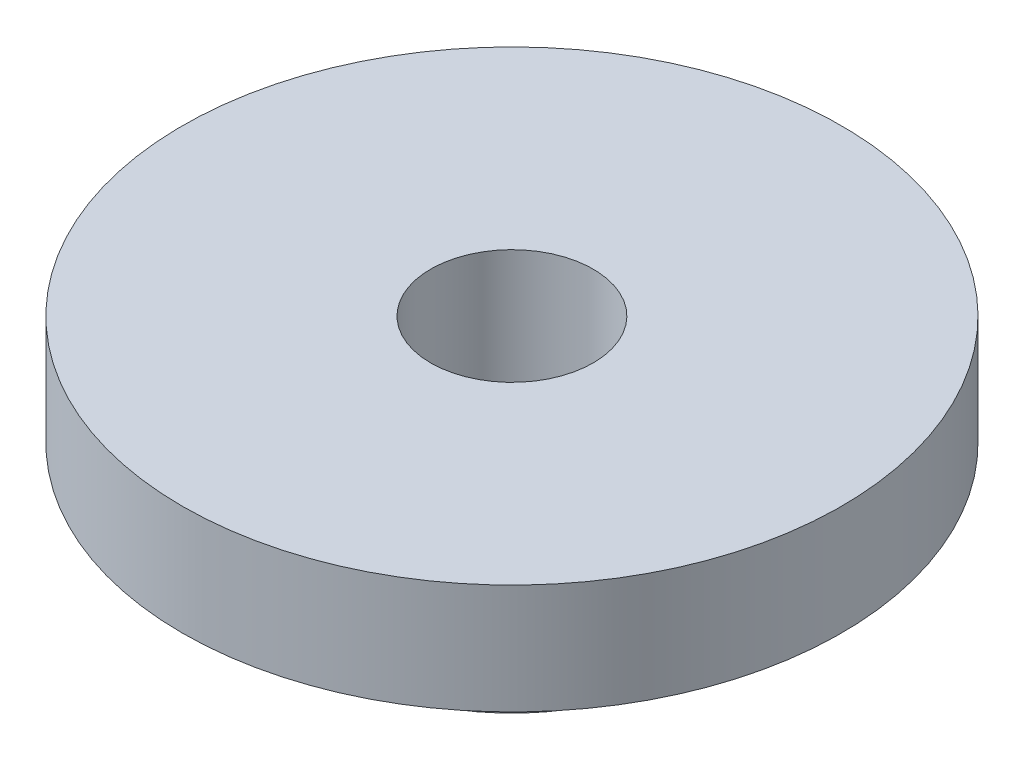
ISO-10303-21;
HEADER;
FILE_DESCRIPTION(('STEP AP214'),'2;1');
FILE_NAME('part.step','',(''),(''),'','','');
FILE_SCHEMA(('AUTOMOTIVE_DESIGN { 1 0 10303 214 1 1 1 1 }'));
ENDSEC;
DATA;
#1=APPLICATION_CONTEXT('core data for automotive mechanical design processes');
#2=APPLICATION_PROTOCOL_DEFINITION('international standard','automotive_design',2000,#1);
#3=PRODUCT_CONTEXT('',#1,'mechanical');
#4=PRODUCT('Part','Part','',(#3));
#5=PRODUCT_RELATED_PRODUCT_CATEGORY('part','',(#4));
#6=PRODUCT_DEFINITION_FORMATION('','',#4);
#7=PRODUCT_DEFINITION_CONTEXT('part definition',#1,'design');
#8=PRODUCT_DEFINITION('design','',#6,#7);
#9=PRODUCT_DEFINITION_SHAPE('','',#8);
#10=(LENGTH_UNIT() NAMED_UNIT(*) SI_UNIT(.MILLI.,.METRE.));
#11=(NAMED_UNIT(*) PLANE_ANGLE_UNIT() SI_UNIT($,.RADIAN.));
#12=(NAMED_UNIT(*) SI_UNIT($,.STERADIAN.) SOLID_ANGLE_UNIT());
#13=UNCERTAINTY_MEASURE_WITH_UNIT(LENGTH_MEASURE(1.E-05),#10,'distance_accuracy_value','');
#14=(GEOMETRIC_REPRESENTATION_CONTEXT(3) GLOBAL_UNCERTAINTY_ASSIGNED_CONTEXT((#13)) GLOBAL_UNIT_ASSIGNED_CONTEXT((#10,
#11,#12)) REPRESENTATION_CONTEXT('',''));
#15=CARTESIAN_POINT('',(0.,0.,0.));
#16=DIRECTION('',(0.,0.,1.));
#17=DIRECTION('',(1.,0.,0.));
#18=AXIS2_PLACEMENT_3D('',#15,#16,#17);
#19=CARTESIAN_POINT('',(0.,2.5,0.));
#20=DIRECTION('',(0.,-1.,0.));
#21=DIRECTION('',(0.,0.,-1.));
#22=AXIS2_PLACEMENT_3D('',#19,#20,#21);
#23=CYLINDRICAL_SURFACE('',#22,4.);
#24=CARTESIAN_POINT('',(0.,2.5,0.));
#25=DIRECTION('',(0.,1.,0.));
#26=DIRECTION('',(0.,0.,1.));
#27=AXIS2_PLACEMENT_3D('',#24,#25,#26);
#28=CIRCLE('',#27,4.);
#29=CARTESIAN_POINT('',(0.,2.5,4.));
#30=VERTEX_POINT('',#29);
#31=EDGE_CURVE('E10',#30,#30,#28,.T.);
#32=ORIENTED_EDGE('',*,*,#31,.F.);
#33=EDGE_LOOP('',(#32));
#34=FACE_BOUND('',#33,.T.);
#35=CARTESIAN_POINT('',(0.,0.,0.));
#36=DIRECTION('',(0.,1.,0.));
#37=DIRECTION('',(0.,0.,1.));
#38=AXIS2_PLACEMENT_3D('',#35,#36,#37);
#39=CIRCLE('',#38,4.);
#40=CARTESIAN_POINT('',(0.,0.,4.));
#41=VERTEX_POINT('',#40);
#42=EDGE_CURVE('E46',#41,#41,#39,.T.);
#43=ORIENTED_EDGE('',*,*,#42,.T.);
#44=EDGE_LOOP('',(#43));
#45=FACE_BOUND('',#44,.T.);
#46=ADVANCED_FACE('F43',(#34,#45),#23,.T.);
#47=CARTESIAN_POINT('',(0.,0.,0.));
#48=DIRECTION('',(0.,1.,0.));
#49=DIRECTION('',(0.,0.,1.));
#50=AXIS2_PLACEMENT_3D('',#47,#48,#49);
#51=PLANE('',#50);
#52=CARTESIAN_POINT('',(0.,0.,0.));
#53=DIRECTION('',(0.,1.,0.));
#54=DIRECTION('',(0.,0.,1.));
#55=AXIS2_PLACEMENT_3D('',#52,#53,#54);
#56=CIRCLE('',#55,1.85);
#57=CARTESIAN_POINT('',(0.,0.,1.85));
#58=VERTEX_POINT('',#57);
#59=EDGE_CURVE('E62',#58,#58,#56,.T.);
#60=ORIENTED_EDGE('',*,*,#59,.T.);
#61=EDGE_LOOP('',(#60));
#62=FACE_BOUND('',#61,.T.);
#63=ORIENTED_EDGE('',*,*,#42,.F.);
#64=EDGE_LOOP('',(#63));
#65=FACE_BOUND('',#64,.T.);
#66=ADVANCED_FACE('F86',(#62,#65),#51,.F.);
#67=CARTESIAN_POINT('',(0.,5.,0.));
#68=DIRECTION('',(0.,-1.,0.));
#69=DIRECTION('',(0.,0.,-1.));
#70=AXIS2_PLACEMENT_3D('',#67,#68,#69);
#71=CYLINDRICAL_SURFACE('',#70,7.5);
#72=CARTESIAN_POINT('',(0.,5.,0.));
#73=DIRECTION('',(0.,1.,0.));
#74=DIRECTION('',(0.,0.,1.));
#75=AXIS2_PLACEMENT_3D('',#72,#73,#74);
#76=CIRCLE('',#75,7.5);
#77=CARTESIAN_POINT('',(0.,5.,7.5));
#78=VERTEX_POINT('',#77);
#79=EDGE_CURVE('E57',#78,#78,#76,.T.);
#80=ORIENTED_EDGE('',*,*,#79,.F.);
#81=EDGE_LOOP('',(#80));
#82=FACE_BOUND('',#81,.T.);
#83=CARTESIAN_POINT('',(0.,2.5,0.));
#84=DIRECTION('',(0.,1.,0.));
#85=DIRECTION('',(0.,0.,1.));
#86=AXIS2_PLACEMENT_3D('',#83,#84,#85);
#87=CIRCLE('',#86,7.5);
#88=CARTESIAN_POINT('',(0.,2.5,7.5));
#89=VERTEX_POINT('',#88);
#90=EDGE_CURVE('E59',#89,#89,#87,.T.);
#91=ORIENTED_EDGE('',*,*,#90,.T.);
#92=EDGE_LOOP('',(#91));
#93=FACE_BOUND('',#92,.T.);
#94=ADVANCED_FACE('F80',(#82,#93),#71,.T.);
#95=CARTESIAN_POINT('',(0.,5.,0.));
#96=DIRECTION('',(0.,1.,0.));
#97=DIRECTION('',(0.,0.,1.));
#98=AXIS2_PLACEMENT_3D('',#95,#96,#97);
#99=PLANE('',#98);
#100=CARTESIAN_POINT('',(0.,5.,0.));
#101=DIRECTION('',(0.,1.,0.));
#102=DIRECTION('',(0.,0.,1.));
#103=AXIS2_PLACEMENT_3D('',#100,#101,#102);
#104=CIRCLE('',#103,1.85);
#105=CARTESIAN_POINT('',(0.,5.,1.85));
#106=VERTEX_POINT('',#105);
#107=EDGE_CURVE('E68',#106,#106,#104,.T.);
#108=ORIENTED_EDGE('',*,*,#107,.F.);
#109=EDGE_LOOP('',(#108));
#110=FACE_BOUND('',#109,.T.);
#111=ORIENTED_EDGE('',*,*,#79,.T.);
#112=EDGE_LOOP('',(#111));
#113=FACE_BOUND('',#112,.T.);
#114=ADVANCED_FACE('F76',(#110,#113),#99,.T.);
#115=CARTESIAN_POINT('',(0.,2.5,0.));
#116=DIRECTION('',(0.,1.,0.));
#117=DIRECTION('',(0.,0.,1.));
#118=AXIS2_PLACEMENT_3D('',#115,#116,#117);
#119=PLANE('',#118);
#120=ORIENTED_EDGE('',*,*,#31,.T.);
#121=EDGE_LOOP('',(#120));
#122=FACE_BOUND('',#121,.T.);
#123=ORIENTED_EDGE('',*,*,#90,.F.);
#124=EDGE_LOOP('',(#123));
#125=FACE_BOUND('',#124,.T.);
#126=ADVANCED_FACE('F79',(#122,#125),#119,.F.);
#127=CARTESIAN_POINT('',(0.,-13.,0.));
#128=DIRECTION('',(0.,1.,0.));
#129=DIRECTION('',(0.,0.,1.));
#130=AXIS2_PLACEMENT_3D('',#127,#128,#129);
#131=CYLINDRICAL_SURFACE('',#130,1.85);
#132=ORIENTED_EDGE('',*,*,#107,.T.);
#133=EDGE_LOOP('',(#132));
#134=FACE_BOUND('',#133,.T.);
#135=ORIENTED_EDGE('',*,*,#59,.F.);
#136=EDGE_LOOP('',(#135));
#137=FACE_BOUND('',#136,.T.);
#138=ADVANCED_FACE('F73',(#134,#137),#131,.F.);
#139=CLOSED_SHELL('',(#46,#66,#94,#114,#126,#138));
#140=MANIFOLD_SOLID_BREP('B2',#139);
#141=ADVANCED_BREP_SHAPE_REPRESENTATION('',(#18,#140),#14);
#142=SHAPE_DEFINITION_REPRESENTATION(#9,#141);
ENDSEC;
END-ISO-10303-21;
